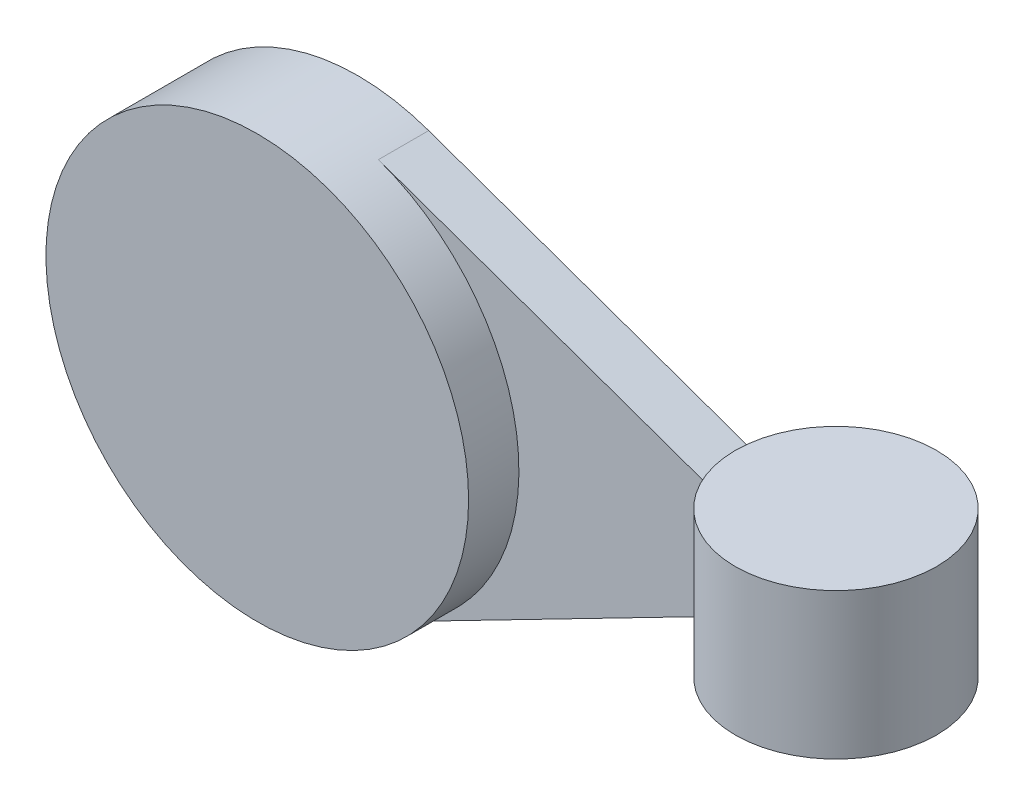
ISO-10303-21;
HEADER;
FILE_DESCRIPTION(('STEP AP214'),'2;1');
FILE_NAME('part.step','',(''),(''),'','','');
FILE_SCHEMA(('AUTOMOTIVE_DESIGN { 1 0 10303 214 1 1 1 1 }'));
ENDSEC;
DATA;
#1=APPLICATION_CONTEXT('core data for automotive mechanical design processes');
#2=APPLICATION_PROTOCOL_DEFINITION('international standard','automotive_design',2000,#1);
#3=PRODUCT_CONTEXT('',#1,'mechanical');
#4=PRODUCT('Part','Part','',(#3));
#5=PRODUCT_RELATED_PRODUCT_CATEGORY('part','',(#4));
#6=PRODUCT_DEFINITION_FORMATION('','',#4);
#7=PRODUCT_DEFINITION_CONTEXT('part definition',#1,'design');
#8=PRODUCT_DEFINITION('design','',#6,#7);
#9=PRODUCT_DEFINITION_SHAPE('','',#8);
#10=(LENGTH_UNIT() NAMED_UNIT(*) SI_UNIT(.MILLI.,.METRE.));
#11=(NAMED_UNIT(*) PLANE_ANGLE_UNIT() SI_UNIT($,.RADIAN.));
#12=(NAMED_UNIT(*) SI_UNIT($,.STERADIAN.) SOLID_ANGLE_UNIT());
#13=UNCERTAINTY_MEASURE_WITH_UNIT(LENGTH_MEASURE(1.E-05),#10,'distance_accuracy_value','');
#14=(GEOMETRIC_REPRESENTATION_CONTEXT(3) GLOBAL_UNCERTAINTY_ASSIGNED_CONTEXT((#13)) GLOBAL_UNIT_ASSIGNED_CONTEXT((#10,
#11,#12)) REPRESENTATION_CONTEXT('',''));
#15=CARTESIAN_POINT('',(0.,0.,0.));
#16=DIRECTION('',(0.,0.,1.));
#17=DIRECTION('',(1.,0.,0.));
#18=AXIS2_PLACEMENT_3D('',#15,#16,#17);
#19=CARTESIAN_POINT('',(19.208719722318,-37.350034626884,25.));
#20=DIRECTION('',(-0.457350469579,0.889286538735333,0.));
#21=DIRECTION('',(-0.889286538735333,-0.457350469579,0.));
#22=AXIS2_PLACEMENT_3D('',#19,#20,#21);
#23=PLANE('',#22);
#24=DIRECTION('',(0.889286538735332,0.457350469579,0.));
#25=VECTOR('',#24,1.);
#26=CARTESIAN_POINT('',(19.208719722318,-37.350034626884,15.));
#27=LINE('',#26,#25);
#28=CARTESIAN_POINT('',(19.208719722318,-37.350034626884,15.));
#29=VERTEX_POINT('',#28);
#30=CARTESIAN_POINT('',(80.6350832689629,-5.75911877591379,15.));
#31=VERTEX_POINT('',#30);
#32=EDGE_CURVE('E150',#29,#31,#27,.T.);
#33=ORIENTED_EDGE('',*,*,#32,.T.);
#34=CARTESIAN_POINT('',(100.,4.20004891023278,20.));
#35=DIRECTION('',(-0.457350469579,0.889286538735333,0.));
#36=DIRECTION('',(0.889286538735333,0.457350469579,0.));
#37=AXIS2_PLACEMENT_3D('',#34,#35,#36);
#38=ELLIPSE('',#37,22.4899389891163,20.);
#39=CARTESIAN_POINT('',(80.6350832689629,-5.7591187759138,25.));
#40=VERTEX_POINT('',#39);
#41=EDGE_CURVE('E60',#31,#40,#38,.T.);
#42=ORIENTED_EDGE('',*,*,#41,.T.);
#43=DIRECTION('',(0.889286538735332,0.457350469579,0.));
#44=VECTOR('',#43,1.);
#45=CARTESIAN_POINT('',(19.208719722318,-37.350034626884,25.));
#46=LINE('',#45,#44);
#47=CARTESIAN_POINT('',(19.208719722318,-37.350034626884,25.));
#48=VERTEX_POINT('',#47);
#49=EDGE_CURVE('E95',#48,#40,#46,.T.);
#50=ORIENTED_EDGE('',*,*,#49,.F.);
#51=DIRECTION('',(0.,0.,-1.));
#52=VECTOR('',#51,1.);
#53=CARTESIAN_POINT('',(19.208719722318,-37.350034626884,25.));
#54=LINE('',#53,#52);
#55=EDGE_CURVE('E98',#48,#29,#54,.T.);
#56=ORIENTED_EDGE('',*,*,#55,.T.);
#57=EDGE_LOOP('',(#33,#42,#50,#56));
#58=FACE_BOUND('',#57,.T.);
#59=ADVANCED_FACE('F37',(#58),#23,.F.);
#60=CARTESIAN_POINT('',(0.,0.,25.));
#61=DIRECTION('',(0.,0.,1.));
#62=DIRECTION('',(1.,0.,0.));
#63=AXIS2_PLACEMENT_3D('',#60,#61,#62);
#64=PLANE('',#63);
#65=DIRECTION('',(-0.942222751750969,0.334986993901005,0.));
#66=VECTOR('',#65,1.);
#67=CARTESIAN_POINT('',(14.0694537438422,39.5733555735407,25.));
#68=LINE('',#67,#66);
#69=CARTESIAN_POINT('',(80.6350832689629,15.9073805264409,25.));
#70=VERTEX_POINT('',#69);
#71=CARTESIAN_POINT('',(14.0694537438422,39.5733555735407,25.));
#72=VERTEX_POINT('',#71);
#73=EDGE_CURVE('E104',#70,#72,#68,.T.);
#74=ORIENTED_EDGE('',*,*,#73,.T.);
#75=CARTESIAN_POINT('',(0.,0.,25.));
#76=DIRECTION('',(0.,0.,1.));
#77=DIRECTION('',(1.,0.,0.));
#78=AXIS2_PLACEMENT_3D('',#75,#76,#77);
#79=CIRCLE('',#78,42.);
#80=EDGE_CURVE('E110',#48,#72,#79,.T.);
#81=ORIENTED_EDGE('',*,*,#80,.F.);
#82=ORIENTED_EDGE('',*,*,#49,.T.);
#83=DIRECTION('',(0.,1.,0.));
#84=VECTOR('',#83,1.);
#85=CARTESIAN_POINT('',(80.6350832689629,22.7172907254556,25.));
#86=LINE('',#85,#84);
#87=EDGE_CURVE('E144',#70,#40,#86,.F.);
#88=ORIENTED_EDGE('',*,*,#87,.F.);
#89=EDGE_LOOP('',(#74,#81,#82,#88));
#90=FACE_BOUND('',#89,.T.);
#91=ADVANCED_FACE('F114',(#90),#64,.T.);
#92=CARTESIAN_POINT('',(0.,0.,15.));
#93=DIRECTION('',(0.,0.,1.));
#94=DIRECTION('',(1.,0.,0.));
#95=AXIS2_PLACEMENT_3D('',#92,#93,#94);
#96=PLANE('',#95);
#97=DIRECTION('',(-0.942222751750969,0.334986993901005,0.));
#98=VECTOR('',#97,1.);
#99=CARTESIAN_POINT('',(14.0694537438422,39.5733555735407,15.));
#100=LINE('',#99,#98);
#101=CARTESIAN_POINT('',(80.6350832689629,15.9073805264409,15.));
#102=VERTEX_POINT('',#101);
#103=CARTESIAN_POINT('',(14.0694537438422,39.5733555735407,15.));
#104=VERTEX_POINT('',#103);
#105=EDGE_CURVE('E154',#102,#104,#100,.T.);
#106=ORIENTED_EDGE('',*,*,#105,.F.);
#107=DIRECTION('',(0.,1.,0.));
#108=VECTOR('',#107,1.);
#109=CARTESIAN_POINT('',(80.6350832689629,22.7172907254556,15.));
#110=LINE('',#109,#108);
#111=EDGE_CURVE('E11',#102,#31,#110,.F.);
#112=ORIENTED_EDGE('',*,*,#111,.T.);
#113=ORIENTED_EDGE('',*,*,#32,.F.);
#114=CARTESIAN_POINT('',(0.,0.,15.));
#115=DIRECTION('',(0.,0.,1.));
#116=DIRECTION('',(1.,0.,0.));
#117=AXIS2_PLACEMENT_3D('',#114,#115,#116);
#118=CIRCLE('',#117,42.);
#119=EDGE_CURVE('E111',#29,#104,#118,.F.);
#120=ORIENTED_EDGE('',*,*,#119,.T.);
#121=EDGE_LOOP('',(#106,#112,#113,#120));
#122=FACE_BOUND('',#121,.T.);
#123=ADVANCED_FACE('F197',(#122),#96,.F.);
#124=CARTESIAN_POINT('',(0.,0.,20.));
#125=DIRECTION('',(0.,0.,-1.));
#126=DIRECTION('',(-1.,0.,0.));
#127=AXIS2_PLACEMENT_3D('',#124,#125,#126);
#128=CYLINDRICAL_SURFACE('',#127,42.);
#129=DIRECTION('',(0.,0.,-1.));
#130=VECTOR('',#129,1.);
#131=CARTESIAN_POINT('',(14.0694537438422,39.5733555735407,25.));
#132=LINE('',#131,#130);
#133=EDGE_CURVE('E112',#72,#104,#132,.T.);
#134=ORIENTED_EDGE('',*,*,#133,.T.);
#135=ORIENTED_EDGE('',*,*,#119,.F.);
#136=ORIENTED_EDGE('',*,*,#55,.F.);
#137=ORIENTED_EDGE('',*,*,#80,.T.);
#138=EDGE_LOOP('',(#134,#135,#136,#137));
#139=FACE_BOUND('',#138,.T.);
#140=CARTESIAN_POINT('',(0.,0.,35.));
#141=DIRECTION('',(0.,0.,1.));
#142=DIRECTION('',(1.,0.,0.));
#143=AXIS2_PLACEMENT_3D('',#140,#141,#142);
#144=CIRCLE('',#143,42.);
#145=CARTESIAN_POINT('',(42.,0.,35.));
#146=VERTEX_POINT('',#145);
#147=EDGE_CURVE('E117',#146,#146,#144,.T.);
#148=ORIENTED_EDGE('',*,*,#147,.F.);
#149=EDGE_LOOP('',(#148));
#150=FACE_BOUND('',#149,.T.);
#151=ADVANCED_FACE('F39',(#139,#150),#128,.T.);
#152=CARTESIAN_POINT('',(14.0694537438422,39.5733555735407,25.));
#153=DIRECTION('',(-0.334986993901005,-0.942222751750969,0.));
#154=DIRECTION('',(0.942222751750969,-0.334986993901005,0.));
#155=AXIS2_PLACEMENT_3D('',#152,#153,#154);
#156=PLANE('',#155);
#157=ORIENTED_EDGE('',*,*,#73,.F.);
#158=CARTESIAN_POINT('',(100.,9.02260170867366,20.));
#159=DIRECTION('',(-0.334986993901005,-0.942222751750969,0.));
#160=DIRECTION('',(-0.942222751750969,0.334986993901005,0.));
#161=AXIS2_PLACEMENT_3D('',#158,#159,#160);
#162=ELLIPSE('',#161,21.2264031651042,20.);
#163=EDGE_CURVE('E141',#70,#102,#162,.T.);
#164=ORIENTED_EDGE('',*,*,#163,.T.);
#165=ORIENTED_EDGE('',*,*,#105,.T.);
#166=ORIENTED_EDGE('',*,*,#133,.F.);
#167=EDGE_LOOP('',(#157,#164,#165,#166));
#168=FACE_BOUND('',#167,.T.);
#169=ADVANCED_FACE('F175',(#168),#156,.F.);
#170=CARTESIAN_POINT('',(100.,0.,20.));
#171=DIRECTION('',(0.,1.,0.));
#172=DIRECTION('',(-1.,0.,0.));
#173=AXIS2_PLACEMENT_3D('',#170,#171,#172);
#174=SPHERICAL_SURFACE('',#173,15.);
#175=CARTESIAN_POINT('',(100.,-8.99999999999999,20.));
#176=DIRECTION('',(0.,1.,0.));
#177=DIRECTION('',(0.,0.,1.));
#178=AXIS2_PLACEMENT_3D('',#175,#176,#177);
#179=CIRCLE('',#178,12.);
#180=CARTESIAN_POINT('',(100.,-8.99999999999999,32.));
#181=VERTEX_POINT('',#180);
#182=EDGE_CURVE('E123',#181,#181,#179,.T.);
#183=ORIENTED_EDGE('',*,*,#182,.F.);
#184=EDGE_LOOP('',(#183));
#185=FACE_BOUND('',#184,.T.);
#186=CARTESIAN_POINT('',(86.,0.,20.));
#187=DIRECTION('',(-1.,0.,0.));
#188=DIRECTION('',(0.,0.,1.));
#189=AXIS2_PLACEMENT_3D('',#186,#187,#188);
#190=CIRCLE('',#189,5.38516480713447);
#191=CARTESIAN_POINT('',(86.,-1.99999999999989,25.));
#192=VERTEX_POINT('',#191);
#193=CARTESIAN_POINT('',(86.,-2.99999999999999,24.4721359549995));
#194=VERTEX_POINT('',#193);
#195=EDGE_CURVE('E134',#192,#194,#190,.F.);
#196=ORIENTED_EDGE('',*,*,#195,.F.);
#197=CARTESIAN_POINT('',(100.,0.,25.));
#198=DIRECTION('',(0.,0.,1.));
#199=DIRECTION('',(1.,0.,0.));
#200=AXIS2_PLACEMENT_3D('',#197,#198,#199);
#201=CIRCLE('',#200,14.1421356237309);
#202=CARTESIAN_POINT('',(86.,1.9999999999999,25.));
#203=VERTEX_POINT('',#202);
#204=EDGE_CURVE('E135',#192,#203,#201,.F.);
#205=ORIENTED_EDGE('',*,*,#204,.T.);
#206=CARTESIAN_POINT('',(86.,1.99999999999989,15.));
#207=VERTEX_POINT('',#206);
#208=EDGE_CURVE('E52',#207,#203,#190,.F.);
#209=ORIENTED_EDGE('',*,*,#208,.F.);
#210=CARTESIAN_POINT('',(100.,0.,15.));
#211=DIRECTION('',(0.,0.,1.));
#212=DIRECTION('',(1.,0.,0.));
#213=AXIS2_PLACEMENT_3D('',#210,#211,#212);
#214=CIRCLE('',#213,14.1421356237309);
#215=CARTESIAN_POINT('',(86.,-1.99999999999989,15.));
#216=VERTEX_POINT('',#215);
#217=EDGE_CURVE('E45',#216,#207,#214,.F.);
#218=ORIENTED_EDGE('',*,*,#217,.F.);
#219=CARTESIAN_POINT('',(86.,-3.,15.5278640450005));
#220=VERTEX_POINT('',#219);
#221=EDGE_CURVE('E133',#220,#216,#190,.F.);
#222=ORIENTED_EDGE('',*,*,#221,.F.);
#223=CARTESIAN_POINT('',(98.2917745199048,3.32152698120484,20.));
#224=DIRECTION('',(-0.457350469579,0.889286538735333,0.));
#225=DIRECTION('',(-0.889286538735333,-0.457350469579,0.));
#226=AXIS2_PLACEMENT_3D('',#223,#224,#225);
#227=CIRCLE('',#226,14.5275401986118);
#228=EDGE_CURVE('E137',#194,#220,#227,.F.);
#229=ORIENTED_EDGE('',*,*,#228,.F.);
#230=EDGE_LOOP('',(#196,#205,#209,#218,#222,#229));
#231=FACE_BOUND('',#230,.T.);
#232=ADVANCED_FACE('F172',(#185,#231),#174,.F.);
#233=CARTESIAN_POINT('',(80.,20.,20.));
#234=DIRECTION('',(0.,1.,0.));
#235=DIRECTION('',(0.,0.,1.));
#236=AXIS2_PLACEMENT_3D('',#233,#234,#235);
#237=PLANE('',#236);
#238=CARTESIAN_POINT('',(100.,20.,20.));
#239=DIRECTION('',(0.,1.,0.));
#240=DIRECTION('',(0.,0.,1.));
#241=AXIS2_PLACEMENT_3D('',#238,#239,#240);
#242=CIRCLE('',#241,20.);
#243=CARTESIAN_POINT('',(100.,20.,40.));
#244=VERTEX_POINT('',#243);
#245=EDGE_CURVE('E129',#244,#244,#242,.T.);
#246=ORIENTED_EDGE('',*,*,#245,.T.);
#247=EDGE_LOOP('',(#246));
#248=FACE_BOUND('',#247,.T.);
#249=ADVANCED_FACE('F174',(#248),#237,.T.);
#250=CARTESIAN_POINT('',(100.,22.7172907254556,20.));
#251=DIRECTION('',(0.,1.,0.));
#252=DIRECTION('',(0.,0.,1.));
#253=AXIS2_PLACEMENT_3D('',#250,#251,#252);
#254=CYLINDRICAL_SURFACE('',#253,20.);
#255=ORIENTED_EDGE('',*,*,#163,.F.);
#256=ORIENTED_EDGE('',*,*,#87,.T.);
#257=ORIENTED_EDGE('',*,*,#41,.F.);
#258=ORIENTED_EDGE('',*,*,#111,.F.);
#259=EDGE_LOOP('',(#255,#256,#257,#258));
#260=FACE_BOUND('',#259,.T.);
#261=CARTESIAN_POINT('',(100.,-9.,20.));
#262=DIRECTION('',(0.,1.,0.));
#263=DIRECTION('',(0.,0.,1.));
#264=AXIS2_PLACEMENT_3D('',#261,#262,#263);
#265=CIRCLE('',#264,20.);
#266=CARTESIAN_POINT('',(100.,-9.,40.));
#267=VERTEX_POINT('',#266);
#268=EDGE_CURVE('E126',#267,#267,#265,.T.);
#269=ORIENTED_EDGE('',*,*,#268,.T.);
#270=EDGE_LOOP('',(#269));
#271=FACE_BOUND('',#270,.T.);
#272=ORIENTED_EDGE('',*,*,#245,.F.);
#273=EDGE_LOOP('',(#272));
#274=FACE_BOUND('',#273,.T.);
#275=ADVANCED_FACE('F182',(#260,#271,#274),#254,.T.);
#276=CARTESIAN_POINT('',(80.,-9.,20.));
#277=DIRECTION('',(0.,-1.,0.));
#278=DIRECTION('',(0.,0.,-1.));
#279=AXIS2_PLACEMENT_3D('',#276,#277,#278);
#280=PLANE('',#279);
#281=ORIENTED_EDGE('',*,*,#182,.T.);
#282=EDGE_LOOP('',(#281));
#283=FACE_BOUND('',#282,.T.);
#284=ORIENTED_EDGE('',*,*,#268,.F.);
#285=EDGE_LOOP('',(#284));
#286=FACE_BOUND('',#285,.T.);
#287=ADVANCED_FACE('F207',(#283,#286),#280,.T.);
#288=DIRECTION('',(0.,1.,0.));
#289=VECTOR('',#288,1.);
#290=CARTESIAN_POINT('',(86.,14.,15.));
#291=LINE('',#290,#289);
#292=EDGE_CURVE('E146',#216,#207,#291,.T.);
#293=ORIENTED_EDGE('',*,*,#292,.F.);
#294=ORIENTED_EDGE('',*,*,#217,.T.);
#295=EDGE_LOOP('',(#293,#294));
#296=FACE_BOUND('',#295,.T.);
#297=ADVANCED_FACE('F162',(#296),#96,.F.);
#298=DIRECTION('',(0.,0.,-1.));
#299=VECTOR('',#298,1.);
#300=CARTESIAN_POINT('',(86.,-3.,25.));
#301=LINE('',#300,#299);
#302=EDGE_CURVE('E103',#194,#220,#301,.T.);
#303=ORIENTED_EDGE('',*,*,#302,.F.);
#304=ORIENTED_EDGE('',*,*,#228,.T.);
#305=EDGE_LOOP('',(#303,#304));
#306=FACE_BOUND('',#305,.T.);
#307=ADVANCED_FACE('F171',(#306),#23,.F.);
#308=ORIENTED_EDGE('',*,*,#204,.F.);
#309=DIRECTION('',(0.,1.,0.));
#310=VECTOR('',#309,1.);
#311=CARTESIAN_POINT('',(86.,14.,25.));
#312=LINE('',#311,#310);
#313=EDGE_CURVE('E147',#192,#203,#312,.T.);
#314=ORIENTED_EDGE('',*,*,#313,.T.);
#315=EDGE_LOOP('',(#308,#314));
#316=FACE_BOUND('',#315,.T.);
#317=ADVANCED_FACE('F199',(#316),#64,.T.);
#318=CARTESIAN_POINT('',(86.,14.,25.));
#319=DIRECTION('',(-1.,0.,0.));
#320=DIRECTION('',(0.,0.,1.));
#321=AXIS2_PLACEMENT_3D('',#318,#319,#320);
#322=PLANE('',#321);
#323=ORIENTED_EDGE('',*,*,#313,.F.);
#324=ORIENTED_EDGE('',*,*,#195,.T.);
#325=ORIENTED_EDGE('',*,*,#302,.T.);
#326=ORIENTED_EDGE('',*,*,#221,.T.);
#327=ORIENTED_EDGE('',*,*,#292,.T.);
#328=ORIENTED_EDGE('',*,*,#208,.T.);
#329=EDGE_LOOP('',(#323,#324,#325,#326,#327,#328));
#330=FACE_BOUND('',#329,.T.);
#331=ADVANCED_FACE('F166',(#330),#322,.F.);
#332=CARTESIAN_POINT('',(0.,0.,35.));
#333=DIRECTION('',(0.,0.,1.));
#334=DIRECTION('',(1.,0.,0.));
#335=AXIS2_PLACEMENT_3D('',#332,#333,#334);
#336=PLANE('',#335);
#337=ORIENTED_EDGE('',*,*,#147,.T.);
#338=EDGE_LOOP('',(#337));
#339=FACE_BOUND('',#338,.T.);
#340=ADVANCED_FACE('F257',(#339),#336,.T.);
#341=CLOSED_SHELL('',(#59,#91,#123,#151,#169,#232,#249,#275,#287,#297,#307,#317,#331,#340));
#342=MANIFOLD_SOLID_BREP('B2',#341);
#343=ADVANCED_BREP_SHAPE_REPRESENTATION('',(#18,#342),#14);
#344=SHAPE_DEFINITION_REPRESENTATION(#9,#343);
ENDSEC;
END-ISO-10303-21;
